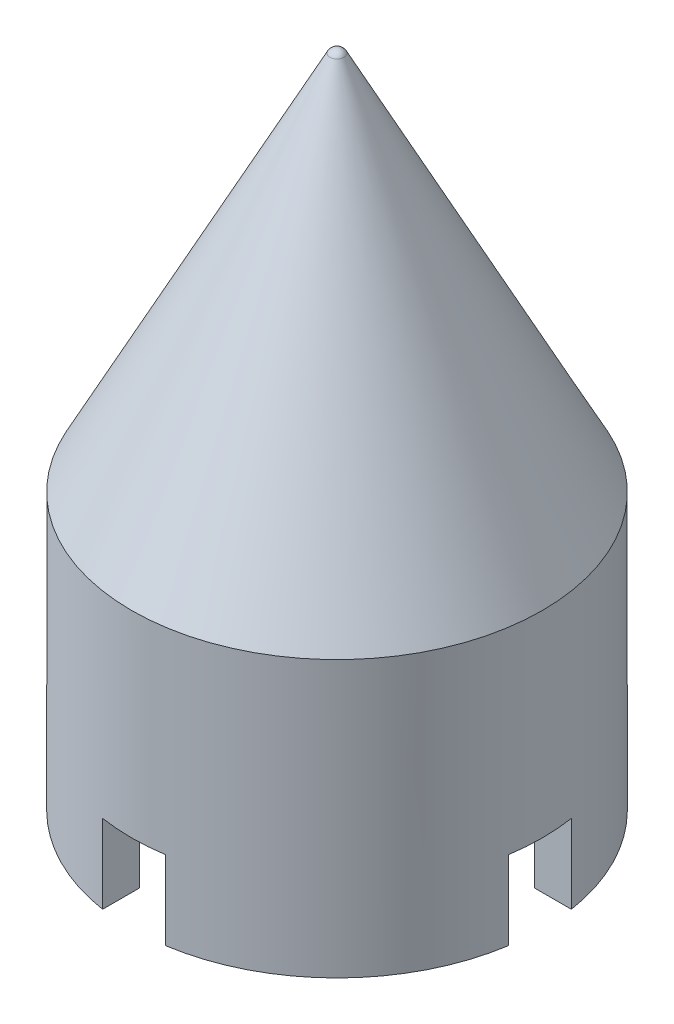
ISO-10303-21;
HEADER;
FILE_DESCRIPTION(('STEP AP214'),'2;1');
FILE_NAME('part.step','',(''),(''),'','','');
FILE_SCHEMA(('AUTOMOTIVE_DESIGN { 1 0 10303 214 1 1 1 1 }'));
ENDSEC;
DATA;
#1=APPLICATION_CONTEXT('core data for automotive mechanical design processes');
#2=APPLICATION_PROTOCOL_DEFINITION('international standard','automotive_design',2000,#1);
#3=PRODUCT_CONTEXT('',#1,'mechanical');
#4=PRODUCT('Part','Part','',(#3));
#5=PRODUCT_RELATED_PRODUCT_CATEGORY('part','',(#4));
#6=PRODUCT_DEFINITION_FORMATION('','',#4);
#7=PRODUCT_DEFINITION_CONTEXT('part definition',#1,'design');
#8=PRODUCT_DEFINITION('design','',#6,#7);
#9=PRODUCT_DEFINITION_SHAPE('','',#8);
#10=(LENGTH_UNIT() NAMED_UNIT(*) SI_UNIT(.MILLI.,.METRE.));
#11=(NAMED_UNIT(*) PLANE_ANGLE_UNIT() SI_UNIT($,.RADIAN.));
#12=(NAMED_UNIT(*) SI_UNIT($,.STERADIAN.) SOLID_ANGLE_UNIT());
#13=UNCERTAINTY_MEASURE_WITH_UNIT(LENGTH_MEASURE(1.E-05),#10,'distance_accuracy_value','');
#14=(GEOMETRIC_REPRESENTATION_CONTEXT(3) GLOBAL_UNCERTAINTY_ASSIGNED_CONTEXT((#13)) GLOBAL_UNIT_ASSIGNED_CONTEXT((#10,
#11,#12)) REPRESENTATION_CONTEXT('',''));
#15=CARTESIAN_POINT('',(0.,0.,0.));
#16=DIRECTION('',(0.,0.,1.));
#17=DIRECTION('',(1.,0.,0.));
#18=AXIS2_PLACEMENT_3D('',#15,#16,#17);
#19=CARTESIAN_POINT('',(0.,0.,0.));
#20=DIRECTION('',(0.,1.,0.));
#21=DIRECTION('',(0.,0.,1.));
#22=AXIS2_PLACEMENT_3D('',#19,#20,#21);
#23=PLANE('',#22);
#24=DIRECTION('',(1.,0.,0.));
#25=VECTOR('',#24,1.);
#26=CARTESIAN_POINT('',(0.,0.,-1.6));
#27=LINE('',#26,#25);
#28=CARTESIAN_POINT('',(-10.3014865432131,0.,-1.6));
#29=VERTEX_POINT('',#28);
#30=CARTESIAN_POINT('',(-8.42440650728584,0.,-1.6));
#31=VERTEX_POINT('',#30);
#32=EDGE_CURVE('E153',#29,#31,#27,.T.);
#33=ORIENTED_EDGE('',*,*,#32,.F.);
#34=CARTESIAN_POINT('',(0.,0.,0.));
#35=DIRECTION('',(0.,1.,0.));
#36=DIRECTION('',(0.,0.,1.));
#37=AXIS2_PLACEMENT_3D('',#34,#35,#36);
#38=CIRCLE('',#37,10.425);
#39=CARTESIAN_POINT('',(-1.6,0.,-10.3014865432131));
#40=VERTEX_POINT('',#39);
#41=EDGE_CURVE('E308',#40,#29,#38,.T.);
#42=ORIENTED_EDGE('',*,*,#41,.F.);
#43=DIRECTION('',(0.,0.,-1.));
#44=VECTOR('',#43,1.);
#45=CARTESIAN_POINT('',(-1.6,0.,0.));
#46=LINE('',#45,#44);
#47=CARTESIAN_POINT('',(-1.6,0.,-8.42440650728584));
#48=VERTEX_POINT('',#47);
#49=EDGE_CURVE('E175',#48,#40,#46,.T.);
#50=ORIENTED_EDGE('',*,*,#49,.F.);
#51=CARTESIAN_POINT('',(0.,0.,0.));
#52=DIRECTION('',(0.,1.,0.));
#53=DIRECTION('',(0.,0.,1.));
#54=AXIS2_PLACEMENT_3D('',#51,#52,#53);
#55=CIRCLE('',#54,8.575);
#56=EDGE_CURVE('E169',#48,#31,#55,.T.);
#57=ORIENTED_EDGE('',*,*,#56,.T.);
#58=EDGE_LOOP('',(#33,#42,#50,#57));
#59=FACE_BOUND('',#58,.T.);
#60=ADVANCED_FACE('F40',(#59),#23,.F.);
#61=CARTESIAN_POINT('',(-10.3014865432131,0.,1.6));
#62=VERTEX_POINT('',#61);
#63=CARTESIAN_POINT('',(-1.6,0.,10.3014865432131));
#64=VERTEX_POINT('',#63);
#65=EDGE_CURVE('E189',#62,#64,#38,.T.);
#66=ORIENTED_EDGE('',*,*,#65,.F.);
#67=DIRECTION('',(1.,0.,0.));
#68=VECTOR('',#67,1.);
#69=CARTESIAN_POINT('',(0.,0.,1.6));
#70=LINE('',#69,#68);
#71=CARTESIAN_POINT('',(-8.42440650728584,0.,1.6));
#72=VERTEX_POINT('',#71);
#73=EDGE_CURVE('E162',#62,#72,#70,.T.);
#74=ORIENTED_EDGE('',*,*,#73,.T.);
#75=CARTESIAN_POINT('',(-1.6,0.,8.42440650728584));
#76=VERTEX_POINT('',#75);
#77=EDGE_CURVE('E177',#72,#76,#55,.T.);
#78=ORIENTED_EDGE('',*,*,#77,.T.);
#79=DIRECTION('',(0.,0.,-1.));
#80=VECTOR('',#79,1.);
#81=CARTESIAN_POINT('',(-1.6,0.,0.));
#82=LINE('',#81,#80);
#83=EDGE_CURVE('E255',#64,#76,#82,.T.);
#84=ORIENTED_EDGE('',*,*,#83,.F.);
#85=EDGE_LOOP('',(#66,#74,#78,#84));
#86=FACE_BOUND('',#85,.T.);
#87=ADVANCED_FACE('F287',(#86),#23,.F.);
#88=DIRECTION('',(1.,0.,0.));
#89=VECTOR('',#88,1.);
#90=CARTESIAN_POINT('',(0.,0.,-1.6));
#91=LINE('',#90,#89);
#92=CARTESIAN_POINT('',(8.42440650728584,0.,-1.6));
#93=VERTEX_POINT('',#92);
#94=CARTESIAN_POINT('',(10.3014865432131,0.,-1.6));
#95=VERTEX_POINT('',#94);
#96=EDGE_CURVE('E240',#93,#95,#91,.T.);
#97=ORIENTED_EDGE('',*,*,#96,.F.);
#98=CARTESIAN_POINT('',(1.6,0.,-8.42440650728584));
#99=VERTEX_POINT('',#98);
#100=EDGE_CURVE('E176',#93,#99,#55,.T.);
#101=ORIENTED_EDGE('',*,*,#100,.T.);
#102=DIRECTION('',(0.,0.,-1.));
#103=VECTOR('',#102,1.);
#104=CARTESIAN_POINT('',(1.6,0.,0.));
#105=LINE('',#104,#103);
#106=CARTESIAN_POINT('',(1.6,0.,-10.3014865432131));
#107=VERTEX_POINT('',#106);
#108=EDGE_CURVE('E222',#99,#107,#105,.T.);
#109=ORIENTED_EDGE('',*,*,#108,.T.);
#110=EDGE_CURVE('E306',#95,#107,#38,.T.);
#111=ORIENTED_EDGE('',*,*,#110,.F.);
#112=EDGE_LOOP('',(#97,#101,#109,#111));
#113=FACE_BOUND('',#112,.T.);
#114=ADVANCED_FACE('F292',(#113),#23,.F.);
#115=CARTESIAN_POINT('',(1.6,0.,10.3014865432131));
#116=VERTEX_POINT('',#115);
#117=CARTESIAN_POINT('',(10.3014865432131,0.,1.6));
#118=VERTEX_POINT('',#117);
#119=EDGE_CURVE('E44',#116,#118,#38,.T.);
#120=ORIENTED_EDGE('',*,*,#119,.F.);
#121=DIRECTION('',(0.,0.,-1.));
#122=VECTOR('',#121,1.);
#123=CARTESIAN_POINT('',(1.6,0.,0.));
#124=LINE('',#123,#122);
#125=CARTESIAN_POINT('',(1.6,0.,8.42440650728584));
#126=VERTEX_POINT('',#125);
#127=EDGE_CURVE('E258',#116,#126,#124,.T.);
#128=ORIENTED_EDGE('',*,*,#127,.T.);
#129=CARTESIAN_POINT('',(8.42440650728584,0.,1.6));
#130=VERTEX_POINT('',#129);
#131=EDGE_CURVE('E180',#126,#130,#55,.T.);
#132=ORIENTED_EDGE('',*,*,#131,.T.);
#133=DIRECTION('',(1.,0.,0.));
#134=VECTOR('',#133,1.);
#135=CARTESIAN_POINT('',(0.,0.,1.6));
#136=LINE('',#135,#134);
#137=EDGE_CURVE('E244',#130,#118,#136,.T.);
#138=ORIENTED_EDGE('',*,*,#137,.T.);
#139=EDGE_LOOP('',(#120,#128,#132,#138));
#140=FACE_BOUND('',#139,.T.);
#141=ADVANCED_FACE('F288',(#140),#23,.F.);
#142=CARTESIAN_POINT('',(0.,14.,0.));
#143=DIRECTION('',(0.,-1.,0.));
#144=DIRECTION('',(0.,0.,-1.));
#145=AXIS2_PLACEMENT_3D('',#142,#143,#144);
#146=CYLINDRICAL_SURFACE('',#145,10.425);
#147=CARTESIAN_POINT('',(0.,4.,0.));
#148=DIRECTION('',(0.,-1.,0.));
#149=DIRECTION('',(0.,0.,-1.));
#150=AXIS2_PLACEMENT_3D('',#147,#148,#149);
#151=CIRCLE('',#150,10.425);
#152=CARTESIAN_POINT('',(-10.3014865432131,4.,1.6));
#153=VERTEX_POINT('',#152);
#154=CARTESIAN_POINT('',(-10.3014865432131,4.,-1.6));
#155=VERTEX_POINT('',#154);
#156=EDGE_CURVE('E182',#153,#155,#151,.T.);
#157=ORIENTED_EDGE('',*,*,#156,.F.);
#158=DIRECTION('',(0.,-1.,0.));
#159=VECTOR('',#158,1.);
#160=CARTESIAN_POINT('',(-10.3014865432131,14.,1.6));
#161=LINE('',#160,#159);
#162=EDGE_CURVE('E198',#153,#62,#161,.T.);
#163=ORIENTED_EDGE('',*,*,#162,.T.);
#164=ORIENTED_EDGE('',*,*,#65,.T.);
#165=DIRECTION('',(0.,-1.,0.));
#166=VECTOR('',#165,1.);
#167=CARTESIAN_POINT('',(-1.6,14.,10.3014865432131));
#168=LINE('',#167,#166);
#169=CARTESIAN_POINT('',(-1.6,4.,10.3014865432131));
#170=VERTEX_POINT('',#169);
#171=EDGE_CURVE('E205',#170,#64,#168,.T.);
#172=ORIENTED_EDGE('',*,*,#171,.F.);
#173=CARTESIAN_POINT('',(0.,4.,0.));
#174=DIRECTION('',(0.,-1.,0.));
#175=DIRECTION('',(0.,0.,-1.));
#176=AXIS2_PLACEMENT_3D('',#173,#174,#175);
#177=CIRCLE('',#176,10.425);
#178=CARTESIAN_POINT('',(1.6,4.,10.3014865432131));
#179=VERTEX_POINT('',#178);
#180=EDGE_CURVE('E192',#179,#170,#177,.T.);
#181=ORIENTED_EDGE('',*,*,#180,.F.);
#182=DIRECTION('',(0.,-1.,0.));
#183=VECTOR('',#182,1.);
#184=CARTESIAN_POINT('',(1.6,14.,10.3014865432131));
#185=LINE('',#184,#183);
#186=EDGE_CURVE('E202',#179,#116,#185,.T.);
#187=ORIENTED_EDGE('',*,*,#186,.T.);
#188=ORIENTED_EDGE('',*,*,#119,.T.);
#189=DIRECTION('',(0.,-1.,0.));
#190=VECTOR('',#189,1.);
#191=CARTESIAN_POINT('',(10.3014865432131,14.,1.6));
#192=LINE('',#191,#190);
#193=CARTESIAN_POINT('',(10.3014865432131,4.,1.6));
#194=VERTEX_POINT('',#193);
#195=EDGE_CURVE('E207',#118,#194,#192,.F.);
#196=ORIENTED_EDGE('',*,*,#195,.T.);
#197=CARTESIAN_POINT('',(0.,4.,0.));
#198=DIRECTION('',(0.,-1.,0.));
#199=DIRECTION('',(0.,0.,-1.));
#200=AXIS2_PLACEMENT_3D('',#197,#198,#199);
#201=CIRCLE('',#200,10.425);
#202=CARTESIAN_POINT('',(10.3014865432131,4.,-1.6));
#203=VERTEX_POINT('',#202);
#204=EDGE_CURVE('E194',#203,#194,#201,.T.);
#205=ORIENTED_EDGE('',*,*,#204,.F.);
#206=DIRECTION('',(0.,-1.,0.));
#207=VECTOR('',#206,1.);
#208=CARTESIAN_POINT('',(10.3014865432131,14.,-1.6));
#209=LINE('',#208,#207);
#210=EDGE_CURVE('E210',#95,#203,#209,.F.);
#211=ORIENTED_EDGE('',*,*,#210,.F.);
#212=ORIENTED_EDGE('',*,*,#110,.T.);
#213=DIRECTION('',(0.,-1.,0.));
#214=VECTOR('',#213,1.);
#215=CARTESIAN_POINT('',(1.6,14.,-10.3014865432131));
#216=LINE('',#215,#214);
#217=CARTESIAN_POINT('',(1.6,4.,-10.3014865432131));
#218=VERTEX_POINT('',#217);
#219=EDGE_CURVE('E172',#107,#218,#216,.F.);
#220=ORIENTED_EDGE('',*,*,#219,.T.);
#221=CARTESIAN_POINT('',(0.,4.,0.));
#222=DIRECTION('',(0.,-1.,0.));
#223=DIRECTION('',(0.,0.,-1.));
#224=AXIS2_PLACEMENT_3D('',#221,#222,#223);
#225=CIRCLE('',#224,10.425);
#226=CARTESIAN_POINT('',(-1.6,4.,-10.3014865432131));
#227=VERTEX_POINT('',#226);
#228=EDGE_CURVE('E196',#227,#218,#225,.T.);
#229=ORIENTED_EDGE('',*,*,#228,.F.);
#230=DIRECTION('',(0.,-1.,0.));
#231=VECTOR('',#230,1.);
#232=CARTESIAN_POINT('',(-1.6,14.,-10.3014865432131));
#233=LINE('',#232,#231);
#234=EDGE_CURVE('E212',#40,#227,#233,.F.);
#235=ORIENTED_EDGE('',*,*,#234,.F.);
#236=ORIENTED_EDGE('',*,*,#41,.T.);
#237=DIRECTION('',(0.,-1.,0.));
#238=VECTOR('',#237,1.);
#239=CARTESIAN_POINT('',(-10.3014865432131,14.,-1.6));
#240=LINE('',#239,#238);
#241=EDGE_CURVE('E156',#155,#29,#240,.T.);
#242=ORIENTED_EDGE('',*,*,#241,.F.);
#243=EDGE_LOOP('',(#157,#163,#164,#172,#181,#187,#188,#196,#205,#211,#212,#220,#229,#235,#236,#242));
#244=FACE_BOUND('',#243,.T.);
#245=CARTESIAN_POINT('',(0.,14.,0.));
#246=DIRECTION('',(0.,1.,0.));
#247=DIRECTION('',(0.,0.,1.));
#248=AXIS2_PLACEMENT_3D('',#245,#246,#247);
#249=CIRCLE('',#248,10.425);
#250=CARTESIAN_POINT('',(0.,14.,-10.4250000000001));
#251=VERTEX_POINT('',#250);
#252=EDGE_CURVE('E12',#251,#251,#249,.T.);
#253=ORIENTED_EDGE('',*,*,#252,.F.);
#254=EDGE_LOOP('',(#253));
#255=FACE_BOUND('',#254,.T.);
#256=ADVANCED_FACE('F42',(#244,#255),#146,.T.);
#257=CARTESIAN_POINT('',(0.,4.,0.));
#258=DIRECTION('',(0.,-1.,0.));
#259=DIRECTION('',(0.,0.,-1.));
#260=AXIS2_PLACEMENT_3D('',#257,#258,#259);
#261=CYLINDRICAL_SURFACE('',#260,8.575);
#262=CARTESIAN_POINT('',(0.,4.,0.));
#263=DIRECTION('',(0.,1.,0.));
#264=DIRECTION('',(0.,0.,1.));
#265=AXIS2_PLACEMENT_3D('',#262,#263,#264);
#266=CIRCLE('',#265,8.575);
#267=CARTESIAN_POINT('',(-1.6,4.,-8.42440650728584));
#268=VERTEX_POINT('',#267);
#269=CARTESIAN_POINT('',(-8.42440650728584,4.,-1.6));
#270=VERTEX_POINT('',#269);
#271=EDGE_CURVE('E171',#268,#270,#266,.T.);
#272=ORIENTED_EDGE('',*,*,#271,.T.);
#273=DIRECTION('',(0.,1.,0.));
#274=VECTOR('',#273,1.);
#275=CARTESIAN_POINT('',(-8.42440650728584,0.,-1.6));
#276=LINE('',#275,#274);
#277=EDGE_CURVE('E63',#31,#270,#276,.T.);
#278=ORIENTED_EDGE('',*,*,#277,.F.);
#279=ORIENTED_EDGE('',*,*,#56,.F.);
#280=DIRECTION('',(0.,1.,0.));
#281=VECTOR('',#280,1.);
#282=CARTESIAN_POINT('',(-1.6,0.,-8.42440650728584));
#283=LINE('',#282,#281);
#284=EDGE_CURVE('E216',#48,#268,#283,.T.);
#285=ORIENTED_EDGE('',*,*,#284,.T.);
#286=EDGE_LOOP('',(#272,#278,#279,#285));
#287=FACE_BOUND('',#286,.T.);
#288=ADVANCED_FACE('F167',(#287),#261,.F.);
#289=DIRECTION('',(0.,1.,0.));
#290=VECTOR('',#289,1.);
#291=CARTESIAN_POINT('',(-8.42440650728584,0.,1.6));
#292=LINE('',#291,#290);
#293=CARTESIAN_POINT('',(-8.42440650728584,4.,1.6));
#294=VERTEX_POINT('',#293);
#295=EDGE_CURVE('E161',#72,#294,#292,.T.);
#296=ORIENTED_EDGE('',*,*,#295,.T.);
#297=CARTESIAN_POINT('',(-1.6,4.,8.42440650728584));
#298=VERTEX_POINT('',#297);
#299=EDGE_CURVE('E185',#294,#298,#266,.T.);
#300=ORIENTED_EDGE('',*,*,#299,.T.);
#301=DIRECTION('',(0.,1.,0.));
#302=VECTOR('',#301,1.);
#303=CARTESIAN_POINT('',(-1.6,0.,8.42440650728584));
#304=LINE('',#303,#302);
#305=EDGE_CURVE('E55',#76,#298,#304,.T.);
#306=ORIENTED_EDGE('',*,*,#305,.F.);
#307=ORIENTED_EDGE('',*,*,#77,.F.);
#308=EDGE_LOOP('',(#296,#300,#306,#307));
#309=FACE_BOUND('',#308,.T.);
#310=ADVANCED_FACE('F325',(#309),#261,.F.);
#311=ORIENTED_EDGE('',*,*,#100,.F.);
#312=DIRECTION('',(0.,1.,0.));
#313=VECTOR('',#312,1.);
#314=CARTESIAN_POINT('',(8.42440650728584,0.,-1.6));
#315=LINE('',#314,#313);
#316=CARTESIAN_POINT('',(8.42440650728584,4.,-1.6));
#317=VERTEX_POINT('',#316);
#318=EDGE_CURVE('E237',#93,#317,#315,.T.);
#319=ORIENTED_EDGE('',*,*,#318,.T.);
#320=CARTESIAN_POINT('',(1.6,4.,-8.42440650728584));
#321=VERTEX_POINT('',#320);
#322=EDGE_CURVE('E190',#317,#321,#266,.T.);
#323=ORIENTED_EDGE('',*,*,#322,.T.);
#324=DIRECTION('',(0.,1.,0.));
#325=VECTOR('',#324,1.);
#326=CARTESIAN_POINT('',(1.6,0.,-8.42440650728584));
#327=LINE('',#326,#325);
#328=EDGE_CURVE('E219',#99,#321,#327,.T.);
#329=ORIENTED_EDGE('',*,*,#328,.F.);
#330=EDGE_LOOP('',(#311,#319,#323,#329));
#331=FACE_BOUND('',#330,.T.);
#332=ADVANCED_FACE('F348',(#331),#261,.F.);
#333=DIRECTION('',(0.,1.,0.));
#334=VECTOR('',#333,1.);
#335=CARTESIAN_POINT('',(1.6,0.,8.42440650728584));
#336=LINE('',#335,#334);
#337=CARTESIAN_POINT('',(1.6,4.,8.42440650728584));
#338=VERTEX_POINT('',#337);
#339=EDGE_CURVE('E250',#126,#338,#336,.T.);
#340=ORIENTED_EDGE('',*,*,#339,.T.);
#341=CARTESIAN_POINT('',(8.42440650728584,4.,1.6));
#342=VERTEX_POINT('',#341);
#343=EDGE_CURVE('E186',#338,#342,#266,.T.);
#344=ORIENTED_EDGE('',*,*,#343,.T.);
#345=DIRECTION('',(0.,1.,0.));
#346=VECTOR('',#345,1.);
#347=CARTESIAN_POINT('',(8.42440650728584,0.,1.6));
#348=LINE('',#347,#346);
#349=EDGE_CURVE('E233',#130,#342,#348,.T.);
#350=ORIENTED_EDGE('',*,*,#349,.F.);
#351=ORIENTED_EDGE('',*,*,#131,.F.);
#352=EDGE_LOOP('',(#340,#344,#350,#351));
#353=FACE_BOUND('',#352,.T.);
#354=ADVANCED_FACE('F336',(#353),#261,.F.);
#355=CARTESIAN_POINT('',(0.,4.,0.));
#356=DIRECTION('',(0.,1.,0.));
#357=DIRECTION('',(0.,0.,1.));
#358=AXIS2_PLACEMENT_3D('',#355,#356,#357);
#359=PLANE('',#358);
#360=ORIENTED_EDGE('',*,*,#343,.F.);
#361=DIRECTION('',(0.,0.,-1.));
#362=VECTOR('',#361,1.);
#363=CARTESIAN_POINT('',(1.6,4.,0.));
#364=LINE('',#363,#362);
#365=EDGE_CURVE('E236',#179,#338,#364,.T.);
#366=ORIENTED_EDGE('',*,*,#365,.F.);
#367=ORIENTED_EDGE('',*,*,#180,.T.);
#368=DIRECTION('',(0.,0.,-1.));
#369=VECTOR('',#368,1.);
#370=CARTESIAN_POINT('',(-1.6,4.,0.));
#371=LINE('',#370,#369);
#372=EDGE_CURVE('E256',#170,#298,#371,.T.);
#373=ORIENTED_EDGE('',*,*,#372,.T.);
#374=ORIENTED_EDGE('',*,*,#299,.F.);
#375=DIRECTION('',(1.,0.,0.));
#376=VECTOR('',#375,1.);
#377=CARTESIAN_POINT('',(0.,4.,1.6));
#378=LINE('',#377,#376);
#379=EDGE_CURVE('E253',#153,#294,#378,.T.);
#380=ORIENTED_EDGE('',*,*,#379,.F.);
#381=ORIENTED_EDGE('',*,*,#156,.T.);
#382=DIRECTION('',(1.,0.,0.));
#383=VECTOR('',#382,1.);
#384=CARTESIAN_POINT('',(0.,4.,-1.6));
#385=LINE('',#384,#383);
#386=EDGE_CURVE('E265',#155,#270,#385,.T.);
#387=ORIENTED_EDGE('',*,*,#386,.T.);
#388=ORIENTED_EDGE('',*,*,#271,.F.);
#389=DIRECTION('',(0.,0.,-1.));
#390=VECTOR('',#389,1.);
#391=CARTESIAN_POINT('',(-1.6,4.,0.));
#392=LINE('',#391,#390);
#393=EDGE_CURVE('E226',#268,#227,#392,.T.);
#394=ORIENTED_EDGE('',*,*,#393,.T.);
#395=ORIENTED_EDGE('',*,*,#228,.T.);
#396=DIRECTION('',(0.,0.,-1.));
#397=VECTOR('',#396,1.);
#398=CARTESIAN_POINT('',(1.6,4.,0.));
#399=LINE('',#398,#397);
#400=EDGE_CURVE('E223',#321,#218,#399,.T.);
#401=ORIENTED_EDGE('',*,*,#400,.F.);
#402=ORIENTED_EDGE('',*,*,#322,.F.);
#403=DIRECTION('',(1.,0.,0.));
#404=VECTOR('',#403,1.);
#405=CARTESIAN_POINT('',(0.,4.,-1.6));
#406=LINE('',#405,#404);
#407=EDGE_CURVE('E241',#317,#203,#406,.T.);
#408=ORIENTED_EDGE('',*,*,#407,.T.);
#409=ORIENTED_EDGE('',*,*,#204,.T.);
#410=DIRECTION('',(1.,0.,0.));
#411=VECTOR('',#410,1.);
#412=CARTESIAN_POINT('',(0.,4.,1.6));
#413=LINE('',#412,#411);
#414=EDGE_CURVE('E218',#342,#194,#413,.T.);
#415=ORIENTED_EDGE('',*,*,#414,.F.);
#416=EDGE_LOOP('',(#360,#366,#367,#373,#374,#380,#381,#387,#388,#394,#395,#401,#402,#408,#409,#415));
#417=FACE_BOUND('',#416,.T.);
#418=ADVANCED_FACE('F320',(#417),#359,.F.);
#419=CARTESIAN_POINT('',(-1.6,0.,0.));
#420=DIRECTION('',(1.,0.,0.));
#421=DIRECTION('',(0.,0.,-1.));
#422=AXIS2_PLACEMENT_3D('',#419,#420,#421);
#423=PLANE('',#422);
#424=ORIENTED_EDGE('',*,*,#234,.T.);
#425=ORIENTED_EDGE('',*,*,#393,.F.);
#426=ORIENTED_EDGE('',*,*,#284,.F.);
#427=ORIENTED_EDGE('',*,*,#49,.T.);
#428=EDGE_LOOP('',(#424,#425,#426,#427));
#429=FACE_BOUND('',#428,.T.);
#430=ADVANCED_FACE('F317',(#429),#423,.T.);
#431=CARTESIAN_POINT('',(1.6,0.,0.));
#432=DIRECTION('',(1.,0.,0.));
#433=DIRECTION('',(0.,0.,-1.));
#434=AXIS2_PLACEMENT_3D('',#431,#432,#433);
#435=PLANE('',#434);
#436=ORIENTED_EDGE('',*,*,#108,.F.);
#437=ORIENTED_EDGE('',*,*,#328,.T.);
#438=ORIENTED_EDGE('',*,*,#400,.T.);
#439=ORIENTED_EDGE('',*,*,#219,.F.);
#440=EDGE_LOOP('',(#436,#437,#438,#439));
#441=FACE_BOUND('',#440,.T.);
#442=ADVANCED_FACE('F351',(#441),#435,.F.);
#443=CARTESIAN_POINT('',(0.,0.,1.6));
#444=DIRECTION('',(0.,0.,1.));
#445=DIRECTION('',(1.,0.,0.));
#446=AXIS2_PLACEMENT_3D('',#443,#444,#445);
#447=PLANE('',#446);
#448=ORIENTED_EDGE('',*,*,#137,.F.);
#449=ORIENTED_EDGE('',*,*,#349,.T.);
#450=ORIENTED_EDGE('',*,*,#414,.T.);
#451=ORIENTED_EDGE('',*,*,#195,.F.);
#452=EDGE_LOOP('',(#448,#449,#450,#451));
#453=FACE_BOUND('',#452,.T.);
#454=ADVANCED_FACE('F338',(#453),#447,.F.);
#455=CARTESIAN_POINT('',(0.,0.,-1.6));
#456=DIRECTION('',(0.,0.,1.));
#457=DIRECTION('',(1.,0.,0.));
#458=AXIS2_PLACEMENT_3D('',#455,#456,#457);
#459=PLANE('',#458);
#460=ORIENTED_EDGE('',*,*,#210,.T.);
#461=ORIENTED_EDGE('',*,*,#407,.F.);
#462=ORIENTED_EDGE('',*,*,#318,.F.);
#463=ORIENTED_EDGE('',*,*,#96,.T.);
#464=EDGE_LOOP('',(#460,#461,#462,#463));
#465=FACE_BOUND('',#464,.T.);
#466=ADVANCED_FACE('F344',(#465),#459,.T.);
#467=CARTESIAN_POINT('',(1.6,0.,0.));
#468=DIRECTION('',(1.,0.,0.));
#469=DIRECTION('',(0.,0.,-1.));
#470=AXIS2_PLACEMENT_3D('',#467,#468,#469);
#471=PLANE('',#470);
#472=ORIENTED_EDGE('',*,*,#365,.T.);
#473=ORIENTED_EDGE('',*,*,#339,.F.);
#474=ORIENTED_EDGE('',*,*,#127,.F.);
#475=ORIENTED_EDGE('',*,*,#186,.F.);
#476=EDGE_LOOP('',(#472,#473,#474,#475));
#477=FACE_BOUND('',#476,.T.);
#478=ADVANCED_FACE('F333',(#477),#471,.F.);
#479=CARTESIAN_POINT('',(-1.6,0.,0.));
#480=DIRECTION('',(1.,0.,0.));
#481=DIRECTION('',(0.,0.,-1.));
#482=AXIS2_PLACEMENT_3D('',#479,#480,#481);
#483=PLANE('',#482);
#484=ORIENTED_EDGE('',*,*,#171,.T.);
#485=ORIENTED_EDGE('',*,*,#83,.T.);
#486=ORIENTED_EDGE('',*,*,#305,.T.);
#487=ORIENTED_EDGE('',*,*,#372,.F.);
#488=EDGE_LOOP('',(#484,#485,#486,#487));
#489=FACE_BOUND('',#488,.T.);
#490=ADVANCED_FACE('F330',(#489),#483,.T.);
#491=CARTESIAN_POINT('',(0.,0.,1.6));
#492=DIRECTION('',(0.,0.,1.));
#493=DIRECTION('',(1.,0.,0.));
#494=AXIS2_PLACEMENT_3D('',#491,#492,#493);
#495=PLANE('',#494);
#496=ORIENTED_EDGE('',*,*,#379,.T.);
#497=ORIENTED_EDGE('',*,*,#295,.F.);
#498=ORIENTED_EDGE('',*,*,#73,.F.);
#499=ORIENTED_EDGE('',*,*,#162,.F.);
#500=EDGE_LOOP('',(#496,#497,#498,#499));
#501=FACE_BOUND('',#500,.T.);
#502=ADVANCED_FACE('F284',(#501),#495,.F.);
#503=CARTESIAN_POINT('',(0.,0.,-1.6));
#504=DIRECTION('',(0.,0.,1.));
#505=DIRECTION('',(1.,0.,0.));
#506=AXIS2_PLACEMENT_3D('',#503,#504,#505);
#507=PLANE('',#506);
#508=ORIENTED_EDGE('',*,*,#241,.T.);
#509=ORIENTED_EDGE('',*,*,#32,.T.);
#510=ORIENTED_EDGE('',*,*,#277,.T.);
#511=ORIENTED_EDGE('',*,*,#386,.F.);
#512=EDGE_LOOP('',(#508,#509,#510,#511));
#513=FACE_BOUND('',#512,.T.);
#514=ADVANCED_FACE('F154',(#513),#507,.T.);
#515=CARTESIAN_POINT('',(0.,33.10980890625,0.));
#516=DIRECTION('',(0.,-1.,0.));
#517=DIRECTION('',(0.,0.,-1.));
#518=AXIS2_PLACEMENT_3D('',#515,#516,#517);
#519=SPHERICAL_SURFACE('',#518,0.411468610913179);
#520=CARTESIAN_POINT('',(0.,33.3,0.));
#521=DIRECTION('',(0.,-1.,0.));
#522=DIRECTION('',(0.,0.,-1.));
#523=AXIS2_PLACEMENT_3D('',#520,#521,#522);
#524=CIRCLE('',#523,0.364874999999997);
#525=CARTESIAN_POINT('',(0.,33.3,-0.364874999999999));
#526=VERTEX_POINT('',#525);
#527=EDGE_CURVE('E229',#526,#526,#524,.T.);
#528=ORIENTED_EDGE('',*,*,#527,.F.);
#529=EDGE_LOOP('',(#528));
#530=FACE_BOUND('',#529,.T.);
#531=ADVANCED_FACE('F276',(#530),#519,.T.);
#532=CARTESIAN_POINT('',(0.,14.,0.));
#533=DIRECTION('',(0.,-1.,0.));
#534=DIRECTION('',(0.,0.,-1.));
#535=AXIS2_PLACEMENT_3D('',#532,#533,#534);
#536=CONICAL_SURFACE('',#535,10.425,0.480502730564661);
#537=CARTESIAN_POINT('',(0.,33.3,-0.364874999999999));
#538=CARTESIAN_POINT('',(0.,33.0989583333333,-0.469667968749998));
#539=CARTESIAN_POINT('',(0.,32.8979166666667,-0.574460937499999));
#540=CARTESIAN_POINT('',(0.,32.4958333333333,-0.784046875000001));
#541=CARTESIAN_POINT('',(0.,32.2947916666667,-0.888839843750001));
#542=CARTESIAN_POINT('',(0.,31.8927083333333,-1.09842578125));
#543=CARTESIAN_POINT('',(0.,31.6916666666667,-1.20321875));
#544=CARTESIAN_POINT('',(0.,31.2895833333333,-1.4128046875));
#545=CARTESIAN_POINT('',(0.,31.0885416666667,-1.51759765625001));
#546=CARTESIAN_POINT('',(0.,30.6864583333333,-1.72718359375001));
#547=CARTESIAN_POINT('',(0.,30.4854166666667,-1.83197656250001));
#548=CARTESIAN_POINT('',(0.,30.0833333333333,-2.04156250000001));
#549=CARTESIAN_POINT('',(0.,29.8822916666667,-2.14635546875001));
#550=CARTESIAN_POINT('',(0.,29.4802083333333,-2.35594140625001));
#551=CARTESIAN_POINT('',(0.,29.2791666666667,-2.46073437500001));
#552=CARTESIAN_POINT('',(0.,28.8770833333333,-2.67032031250001));
#553=CARTESIAN_POINT('',(0.,28.6760416666667,-2.77511328125001));
#554=CARTESIAN_POINT('',(0.,28.2739583333333,-2.98469921875001));
#555=CARTESIAN_POINT('',(0.,28.0729166666667,-3.08949218750001));
#556=CARTESIAN_POINT('',(0.,27.6708333333333,-3.29907812500001));
#557=CARTESIAN_POINT('',(0.,27.4697916666667,-3.40387109375002));
#558=CARTESIAN_POINT('',(0.,27.0677083333333,-3.61345703125002));
#559=CARTESIAN_POINT('',(0.,26.8666666666667,-3.71825000000002));
#560=CARTESIAN_POINT('',(0.,26.4645833333333,-3.92783593750002));
#561=CARTESIAN_POINT('',(0.,26.2635416666667,-4.03262890625002));
#562=CARTESIAN_POINT('',(0.,25.8614583333333,-4.24221484375002));
#563=CARTESIAN_POINT('',(0.,25.6604166666667,-4.34700781250002));
#564=CARTESIAN_POINT('',(0.,25.2583333333333,-4.55659375000002));
#565=CARTESIAN_POINT('',(0.,25.0572916666667,-4.66138671875002));
#566=CARTESIAN_POINT('',(0.,24.6552083333333,-4.87097265625002));
#567=CARTESIAN_POINT('',(0.,24.4541666666667,-4.97576562500002));
#568=CARTESIAN_POINT('',(0.,24.0520833333333,-5.18535156250003));
#569=CARTESIAN_POINT('',(0.,23.8510416666667,-5.29014453125003));
#570=CARTESIAN_POINT('',(0.,23.4489583333333,-5.49973046875003));
#571=CARTESIAN_POINT('',(0.,23.2479166666667,-5.60452343750003));
#572=CARTESIAN_POINT('',(0.,22.8458333333333,-5.81410937500003));
#573=CARTESIAN_POINT('',(0.,22.6447916666667,-5.91890234375003));
#574=CARTESIAN_POINT('',(0.,22.2427083333333,-6.12848828125003));
#575=CARTESIAN_POINT('',(0.,22.0416666666667,-6.23328125000003));
#576=CARTESIAN_POINT('',(0.,21.6395833333333,-6.44286718750003));
#577=CARTESIAN_POINT('',(0.,21.4385416666667,-6.54766015625003));
#578=CARTESIAN_POINT('',(0.,21.0364583333333,-6.75724609375003));
#579=CARTESIAN_POINT('',(0.,20.8354166666667,-6.86203906250003));
#580=CARTESIAN_POINT('',(0.,20.4333333333333,-7.07162500000004));
#581=CARTESIAN_POINT('',(0.,20.2322916666667,-7.17641796875004));
#582=CARTESIAN_POINT('',(0.,19.8302083333333,-7.38600390625004));
#583=CARTESIAN_POINT('',(0.,19.6291666666667,-7.49079687500004));
#584=CARTESIAN_POINT('',(0.,19.2270833333333,-7.70038281250004));
#585=CARTESIAN_POINT('',(0.,19.0260416666667,-7.80517578125004));
#586=CARTESIAN_POINT('',(0.,18.6239583333333,-8.01476171875004));
#587=CARTESIAN_POINT('',(0.,18.4229166666667,-8.11955468750004));
#588=CARTESIAN_POINT('',(0.,18.0208333333333,-8.32914062500004));
#589=CARTESIAN_POINT('',(0.,17.8197916666667,-8.43393359375004));
#590=CARTESIAN_POINT('',(0.,17.4177083333333,-8.64351953125004));
#591=CARTESIAN_POINT('',(0.,17.2166666666667,-8.74831250000004));
#592=CARTESIAN_POINT('',(0.,16.8145833333333,-8.95789843750004));
#593=CARTESIAN_POINT('',(0.,16.6135416666667,-9.06269140625005));
#594=CARTESIAN_POINT('',(0.,16.2114583333333,-9.27227734375005));
#595=CARTESIAN_POINT('',(0.,16.0104166666667,-9.37707031250005));
#596=CARTESIAN_POINT('',(0.,15.6083333333333,-9.58665625000005));
#597=CARTESIAN_POINT('',(0.,15.4072916666667,-9.69144921875005));
#598=CARTESIAN_POINT('',(0.,15.0052083333333,-9.90103515625005));
#599=CARTESIAN_POINT('',(0.,14.8041666666667,-10.0058281250001));
#600=CARTESIAN_POINT('',(0.,14.4020833333333,-10.2154140625001));
#601=CARTESIAN_POINT('',(0.,14.2010416666667,-10.3202070312501));
#602=CARTESIAN_POINT('',(0.,14.,-10.4250000000001));
#603=B_SPLINE_CURVE_WITH_KNOTS('',3,(#537,#538,#539,#540,#541,#542,#543,#544,#545,#546,#547,
#548,#549,#550,#551,#552,#553,#554,#555,#556,#557,#558,#559,#560,#561,#562,#563,#564,#565,#566,
#567,#568,#569,#570,#571,#572,#573,#574,#575,#576,#577,#578,#579,#580,#581,#582,#583,#584,#585,
#586,#587,#588,#589,#590,#591,#592,#593,#594,#595,#596,#597,#598,#599,#600,#601,#602),
.UNSPECIFIED.,.F.,.F.,(4,2,2,2,2,2,2,2,2,2,2,2,2,2,2,2,2,2,2,2,2,2,2,2,2,2,2,2,2,2,2,2,4),(0.,
0.680142530885948,1.3602850617719,2.04042759265786,2.7205701235438,3.40071265442975,
4.08085518531571,4.76099771620166,5.44114024708761,6.12128277797356,6.80142530885951,
7.48156783974546,8.16171037063141,8.84185290151737,9.52199543240332,10.2021379632893,
10.8822804941752,11.5624230250612,12.2425655559471,12.9227080868331,13.602850617719,
14.282993148605,14.9631356794909,15.6432782103769,16.3234207412628,17.0035632721488,
17.6837058030347,18.3638483339207,19.0439908648066,19.7241333956926,20.4042759265785,
21.0844184574645,21.7645609883504),.UNSPECIFIED.);
#604=EDGE_CURVE('BSEAM273',#526,#251,#603,.T.);
#605=ORIENTED_EDGE('',*,*,#527,.T.);
#606=ORIENTED_EDGE('',*,*,#252,.T.);
#607=ORIENTED_EDGE('',*,*,#604,.T.);
#608=ORIENTED_EDGE('',*,*,#604,.F.);
#609=EDGE_LOOP('',(#605,#607,#606,#608));
#610=FACE_BOUND('',#609,.T.);
#611=ADVANCED_FACE('F273',(#610),#536,.T.);
#612=CLOSED_SHELL('',(#60,#87,#114,#141,#256,#288,#310,#332,#354,#418,#430,#442,#454,#466,#478,
#490,#502,#514,#531,#611));
#613=MANIFOLD_SOLID_BREP('B2',#612);
#614=ADVANCED_BREP_SHAPE_REPRESENTATION('',(#18,#613),#14);
#615=SHAPE_DEFINITION_REPRESENTATION(#9,#614);
ENDSEC;
END-ISO-10303-21;
